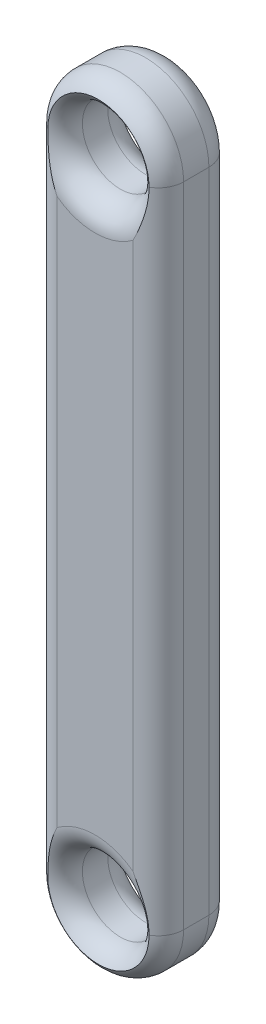
ISO-10303-21;
HEADER;
FILE_DESCRIPTION(('STEP AP214'),'2;1');
FILE_NAME('part.step','',(''),(''),'','','');
FILE_SCHEMA(('AUTOMOTIVE_DESIGN { 1 0 10303 214 1 1 1 1 }'));
ENDSEC;
DATA;
#1=APPLICATION_CONTEXT('core data for automotive mechanical design processes');
#2=APPLICATION_PROTOCOL_DEFINITION('international standard','automotive_design',2000,#1);
#3=PRODUCT_CONTEXT('',#1,'mechanical');
#4=PRODUCT('Part','Part','',(#3));
#5=PRODUCT_RELATED_PRODUCT_CATEGORY('part','',(#4));
#6=PRODUCT_DEFINITION_FORMATION('','',#4);
#7=PRODUCT_DEFINITION_CONTEXT('part definition',#1,'design');
#8=PRODUCT_DEFINITION('design','',#6,#7);
#9=PRODUCT_DEFINITION_SHAPE('','',#8);
#10=(LENGTH_UNIT() NAMED_UNIT(*) SI_UNIT(.MILLI.,.METRE.));
#11=(NAMED_UNIT(*) PLANE_ANGLE_UNIT() SI_UNIT($,.RADIAN.));
#12=(NAMED_UNIT(*) SI_UNIT($,.STERADIAN.) SOLID_ANGLE_UNIT());
#13=UNCERTAINTY_MEASURE_WITH_UNIT(LENGTH_MEASURE(1.E-05),#10,'distance_accuracy_value','');
#14=(GEOMETRIC_REPRESENTATION_CONTEXT(3) GLOBAL_UNCERTAINTY_ASSIGNED_CONTEXT((#13)) GLOBAL_UNIT_ASSIGNED_CONTEXT((#10,
#11,#12)) REPRESENTATION_CONTEXT('',''));
#15=CARTESIAN_POINT('',(0.,0.,0.));
#16=DIRECTION('',(0.,0.,1.));
#17=DIRECTION('',(1.,0.,0.));
#18=AXIS2_PLACEMENT_3D('',#15,#16,#17);
#19=CARTESIAN_POINT('',(0.,0.,3.));
#20=DIRECTION('',(0.,0.,1.));
#21=DIRECTION('',(1.,0.,0.));
#22=AXIS2_PLACEMENT_3D('',#19,#20,#21);
#23=PLANE('',#22);
#24=DIRECTION('',(0.,1.,0.));
#25=VECTOR('',#24,1.);
#26=CARTESIAN_POINT('',(1.5,25.6,3.));
#27=LINE('',#26,#25);
#28=CARTESIAN_POINT('',(1.5,2.,3.));
#29=VERTEX_POINT('',#28);
#30=CARTESIAN_POINT('',(1.5,23.6,3.));
#31=VERTEX_POINT('',#30);
#32=EDGE_CURVE('E343',#29,#31,#27,.T.);
#33=ORIENTED_EDGE('',*,*,#32,.T.);
#34=CARTESIAN_POINT('',(0.,25.6,3.));
#35=DIRECTION('',(0.,0.,1.));
#36=DIRECTION('',(1.,0.,0.));
#37=AXIS2_PLACEMENT_3D('',#34,#35,#36);
#38=CIRCLE('',#37,2.5);
#39=CARTESIAN_POINT('',(-1.5,23.6,3.));
#40=VERTEX_POINT('',#39);
#41=EDGE_CURVE('E340',#31,#40,#38,.F.);
#42=ORIENTED_EDGE('',*,*,#41,.T.);
#43=DIRECTION('',(0.,-1.,0.));
#44=VECTOR('',#43,1.);
#45=CARTESIAN_POINT('',(-1.5,0.,3.));
#46=LINE('',#45,#44);
#47=CARTESIAN_POINT('',(-1.5,2.,3.));
#48=VERTEX_POINT('',#47);
#49=EDGE_CURVE('E345',#40,#48,#46,.T.);
#50=ORIENTED_EDGE('',*,*,#49,.T.);
#51=CARTESIAN_POINT('',(0.,0.,3.));
#52=DIRECTION('',(0.,0.,1.));
#53=DIRECTION('',(1.,0.,0.));
#54=AXIS2_PLACEMENT_3D('',#51,#52,#53);
#55=CIRCLE('',#54,2.5);
#56=EDGE_CURVE('E348',#48,#29,#55,.F.);
#57=ORIENTED_EDGE('',*,*,#56,.T.);
#58=EDGE_LOOP('',(#33,#42,#50,#57));
#59=FACE_BOUND('',#58,.T.);
#60=ADVANCED_FACE('F33',(#59),#23,.T.);
#61=CARTESIAN_POINT('',(0.,0.,0.));
#62=DIRECTION('',(0.,0.,1.));
#63=DIRECTION('',(1.,0.,0.));
#64=AXIS2_PLACEMENT_3D('',#61,#62,#63);
#65=PLANE('',#64);
#66=DIRECTION('',(0.,-1.,0.));
#67=VECTOR('',#66,1.);
#68=CARTESIAN_POINT('',(-1.5,0.,0.));
#69=LINE('',#68,#67);
#70=CARTESIAN_POINT('',(-1.5,2.,0.));
#71=VERTEX_POINT('',#70);
#72=CARTESIAN_POINT('',(-1.5,23.6,0.));
#73=VERTEX_POINT('',#72);
#74=EDGE_CURVE('E330',#71,#73,#69,.F.);
#75=ORIENTED_EDGE('',*,*,#74,.T.);
#76=CARTESIAN_POINT('',(0.,25.6,0.));
#77=DIRECTION('',(0.,0.,1.));
#78=DIRECTION('',(1.,0.,0.));
#79=AXIS2_PLACEMENT_3D('',#76,#77,#78);
#80=CIRCLE('',#79,2.5);
#81=CARTESIAN_POINT('',(1.5,23.6,0.));
#82=VERTEX_POINT('',#81);
#83=EDGE_CURVE('E329',#73,#82,#80,.T.);
#84=ORIENTED_EDGE('',*,*,#83,.T.);
#85=DIRECTION('',(0.,1.,0.));
#86=VECTOR('',#85,1.);
#87=CARTESIAN_POINT('',(1.5,0.,0.));
#88=LINE('',#87,#86);
#89=CARTESIAN_POINT('',(1.5,2.,0.));
#90=VERTEX_POINT('',#89);
#91=EDGE_CURVE('E103',#82,#90,#88,.F.);
#92=ORIENTED_EDGE('',*,*,#91,.T.);
#93=CARTESIAN_POINT('',(0.,0.,0.));
#94=DIRECTION('',(0.,0.,1.));
#95=DIRECTION('',(1.,0.,0.));
#96=AXIS2_PLACEMENT_3D('',#93,#94,#95);
#97=CIRCLE('',#96,2.5);
#98=EDGE_CURVE('E335',#90,#71,#97,.T.);
#99=ORIENTED_EDGE('',*,*,#98,.T.);
#100=EDGE_LOOP('',(#75,#84,#92,#99));
#101=FACE_BOUND('',#100,.T.);
#102=ADVANCED_FACE('F160',(#101),#65,.F.);
#103=CARTESIAN_POINT('',(0.,0.,3.));
#104=DIRECTION('',(0.,0.,-1.));
#105=DIRECTION('',(-1.,0.,0.));
#106=AXIS2_PLACEMENT_3D('',#103,#104,#105);
#107=CYLINDRICAL_SURFACE('',#106,2.5);
#108=DIRECTION('',(0.,0.,-1.));
#109=VECTOR('',#108,1.);
#110=CARTESIAN_POINT('',(2.5,0.,3.));
#111=LINE('',#110,#109);
#112=CARTESIAN_POINT('',(2.5,0.,2.));
#113=VERTEX_POINT('',#112);
#114=CARTESIAN_POINT('',(2.5,0.,1.));
#115=VERTEX_POINT('',#114);
#116=EDGE_CURVE('E357',#113,#115,#111,.T.);
#117=ORIENTED_EDGE('',*,*,#116,.F.);
#118=CARTESIAN_POINT('',(0.,0.,2.));
#119=DIRECTION('',(0.,0.,1.));
#120=DIRECTION('',(1.,0.,0.));
#121=AXIS2_PLACEMENT_3D('',#118,#119,#120);
#122=CIRCLE('',#121,2.5);
#123=CARTESIAN_POINT('',(-2.5,0.,2.));
#124=VERTEX_POINT('',#123);
#125=EDGE_CURVE('E351',#113,#124,#122,.F.);
#126=ORIENTED_EDGE('',*,*,#125,.T.);
#127=DIRECTION('',(0.,0.,-1.));
#128=VECTOR('',#127,1.);
#129=CARTESIAN_POINT('',(-2.5,0.,3.));
#130=LINE('',#129,#128);
#131=CARTESIAN_POINT('',(-2.5,0.,1.));
#132=VERTEX_POINT('',#131);
#133=EDGE_CURVE('E252',#124,#132,#130,.T.);
#134=ORIENTED_EDGE('',*,*,#133,.T.);
#135=CARTESIAN_POINT('',(0.,0.,1.));
#136=DIRECTION('',(0.,0.,1.));
#137=DIRECTION('',(1.,0.,0.));
#138=AXIS2_PLACEMENT_3D('',#135,#136,#137);
#139=CIRCLE('',#138,2.5);
#140=EDGE_CURVE('E354',#132,#115,#139,.T.);
#141=ORIENTED_EDGE('',*,*,#140,.T.);
#142=EDGE_LOOP('',(#117,#126,#134,#141));
#143=FACE_BOUND('',#142,.T.);
#144=ADVANCED_FACE('F166',(#143),#107,.T.);
#145=CARTESIAN_POINT('',(2.5,0.,3.));
#146=DIRECTION('',(-1.,0.,0.));
#147=DIRECTION('',(0.,-1.,0.));
#148=AXIS2_PLACEMENT_3D('',#145,#146,#147);
#149=PLANE('',#148);
#150=DIRECTION('',(0.,0.,-1.));
#151=VECTOR('',#150,1.);
#152=CARTESIAN_POINT('',(2.5,25.6,3.));
#153=LINE('',#152,#151);
#154=CARTESIAN_POINT('',(2.5,25.6,2.));
#155=VERTEX_POINT('',#154);
#156=CARTESIAN_POINT('',(2.5,25.6,1.));
#157=VERTEX_POINT('',#156);
#158=EDGE_CURVE('E360',#155,#157,#153,.T.);
#159=ORIENTED_EDGE('',*,*,#158,.F.);
#160=DIRECTION('',(0.,1.,0.));
#161=VECTOR('',#160,1.);
#162=CARTESIAN_POINT('',(2.5,0.,2.));
#163=LINE('',#162,#161);
#164=EDGE_CURVE('E309',#155,#113,#163,.F.);
#165=ORIENTED_EDGE('',*,*,#164,.T.);
#166=ORIENTED_EDGE('',*,*,#116,.T.);
#167=DIRECTION('',(0.,1.,0.));
#168=VECTOR('',#167,1.);
#169=CARTESIAN_POINT('',(2.5,0.,1.));
#170=LINE('',#169,#168);
#171=EDGE_CURVE('E338',#115,#157,#170,.T.);
#172=ORIENTED_EDGE('',*,*,#171,.T.);
#173=EDGE_LOOP('',(#159,#165,#166,#172));
#174=FACE_BOUND('',#173,.T.);
#175=ADVANCED_FACE('F181',(#174),#149,.F.);
#176=CARTESIAN_POINT('',(0.,25.6,3.));
#177=DIRECTION('',(0.,0.,-1.));
#178=DIRECTION('',(-1.,0.,0.));
#179=AXIS2_PLACEMENT_3D('',#176,#177,#178);
#180=CYLINDRICAL_SURFACE('',#179,2.5);
#181=DIRECTION('',(0.,0.,-1.));
#182=VECTOR('',#181,1.);
#183=CARTESIAN_POINT('',(-2.5,25.6,3.));
#184=LINE('',#183,#182);
#185=CARTESIAN_POINT('',(-2.5,25.6,2.));
#186=VERTEX_POINT('',#185);
#187=CARTESIAN_POINT('',(-2.5,25.6,1.));
#188=VERTEX_POINT('',#187);
#189=EDGE_CURVE('E362',#186,#188,#184,.T.);
#190=ORIENTED_EDGE('',*,*,#189,.F.);
#191=CARTESIAN_POINT('',(0.,25.6,2.));
#192=DIRECTION('',(0.,0.,1.));
#193=DIRECTION('',(1.,0.,0.));
#194=AXIS2_PLACEMENT_3D('',#191,#192,#193);
#195=CIRCLE('',#194,2.5);
#196=EDGE_CURVE('E274',#186,#155,#195,.F.);
#197=ORIENTED_EDGE('',*,*,#196,.T.);
#198=ORIENTED_EDGE('',*,*,#158,.T.);
#199=CARTESIAN_POINT('',(0.,25.6,1.));
#200=DIRECTION('',(0.,0.,1.));
#201=DIRECTION('',(1.,0.,0.));
#202=AXIS2_PLACEMENT_3D('',#199,#200,#201);
#203=CIRCLE('',#202,2.5);
#204=EDGE_CURVE('E52',#157,#188,#203,.T.);
#205=ORIENTED_EDGE('',*,*,#204,.T.);
#206=EDGE_LOOP('',(#190,#197,#198,#205));
#207=FACE_BOUND('',#206,.T.);
#208=ADVANCED_FACE('F177',(#207),#180,.T.);
#209=CARTESIAN_POINT('',(-2.5,0.,3.));
#210=DIRECTION('',(1.,0.,0.));
#211=DIRECTION('',(0.,1.,0.));
#212=AXIS2_PLACEMENT_3D('',#209,#210,#211);
#213=PLANE('',#212);
#214=ORIENTED_EDGE('',*,*,#133,.F.);
#215=DIRECTION('',(0.,-1.,0.));
#216=VECTOR('',#215,1.);
#217=CARTESIAN_POINT('',(-2.5,25.6,2.));
#218=LINE('',#217,#216);
#219=EDGE_CURVE('E273',#124,#186,#218,.F.);
#220=ORIENTED_EDGE('',*,*,#219,.T.);
#221=ORIENTED_EDGE('',*,*,#189,.T.);
#222=DIRECTION('',(0.,-1.,0.));
#223=VECTOR('',#222,1.);
#224=CARTESIAN_POINT('',(-2.5,0.,1.));
#225=LINE('',#224,#223);
#226=EDGE_CURVE('E269',#188,#132,#225,.T.);
#227=ORIENTED_EDGE('',*,*,#226,.T.);
#228=EDGE_LOOP('',(#214,#220,#221,#227));
#229=FACE_BOUND('',#228,.T.);
#230=ADVANCED_FACE('F174',(#229),#213,.F.);
#231=CARTESIAN_POINT('',(0.,25.6,3.));
#232=DIRECTION('',(0.,0.,-1.));
#233=DIRECTION('',(-1.,0.,0.));
#234=AXIS2_PLACEMENT_3D('',#231,#232,#233);
#235=CYLINDRICAL_SURFACE('',#234,1.5);
#236=CARTESIAN_POINT('',(0.,25.6,1.));
#237=DIRECTION('',(0.,0.,1.));
#238=DIRECTION('',(1.,0.,0.));
#239=AXIS2_PLACEMENT_3D('',#236,#237,#238);
#240=CIRCLE('',#239,1.5);
#241=CARTESIAN_POINT('',(1.5,25.6,1.));
#242=VERTEX_POINT('',#241);
#243=EDGE_CURVE('E284',#242,#242,#240,.F.);
#244=ORIENTED_EDGE('',*,*,#243,.T.);
#245=EDGE_LOOP('',(#244));
#246=FACE_BOUND('',#245,.T.);
#247=CARTESIAN_POINT('',(0.,25.6,2.));
#248=DIRECTION('',(0.,0.,1.));
#249=DIRECTION('',(1.,0.,0.));
#250=AXIS2_PLACEMENT_3D('',#247,#248,#249);
#251=CIRCLE('',#250,1.5);
#252=CARTESIAN_POINT('',(1.5,25.6,2.));
#253=VERTEX_POINT('',#252);
#254=EDGE_CURVE('E276',#253,#253,#251,.T.);
#255=ORIENTED_EDGE('',*,*,#254,.T.);
#256=EDGE_LOOP('',(#255));
#257=FACE_BOUND('',#256,.T.);
#258=ADVANCED_FACE('F171',(#246,#257),#235,.F.);
#259=CARTESIAN_POINT('',(0.,0.,3.));
#260=DIRECTION('',(0.,0.,-1.));
#261=DIRECTION('',(-1.,0.,0.));
#262=AXIS2_PLACEMENT_3D('',#259,#260,#261);
#263=CYLINDRICAL_SURFACE('',#262,1.5);
#264=CARTESIAN_POINT('',(0.,0.,1.));
#265=DIRECTION('',(0.,0.,1.));
#266=DIRECTION('',(1.,0.,0.));
#267=AXIS2_PLACEMENT_3D('',#264,#265,#266);
#268=CIRCLE('',#267,1.5);
#269=CARTESIAN_POINT('',(1.5,0.,1.));
#270=VERTEX_POINT('',#269);
#271=EDGE_CURVE('E11',#270,#270,#268,.F.);
#272=ORIENTED_EDGE('',*,*,#271,.T.);
#273=EDGE_LOOP('',(#272));
#274=FACE_BOUND('',#273,.T.);
#275=CARTESIAN_POINT('',(0.,0.,2.));
#276=DIRECTION('',(0.,0.,1.));
#277=DIRECTION('',(1.,0.,0.));
#278=AXIS2_PLACEMENT_3D('',#275,#276,#277);
#279=CIRCLE('',#278,1.5);
#280=CARTESIAN_POINT('',(1.5,0.,2.));
#281=VERTEX_POINT('',#280);
#282=EDGE_CURVE('E43',#281,#281,#279,.T.);
#283=ORIENTED_EDGE('',*,*,#282,.T.);
#284=EDGE_LOOP('',(#283));
#285=FACE_BOUND('',#284,.T.);
#286=ADVANCED_FACE('F451',(#274,#285),#263,.F.);
#287=CARTESIAN_POINT('',(0.,25.6,2.));
#288=DIRECTION('',(0.,0.,1.));
#289=DIRECTION('',(1.,0.,0.));
#290=AXIS2_PLACEMENT_3D('',#287,#288,#289);
#291=TOROIDAL_SURFACE('',#290,2.5,1.);
#292=ORIENTED_EDGE('',*,*,#254,.F.);
#293=EDGE_LOOP('',(#292));
#294=FACE_BOUND('',#293,.T.);
#295=CARTESIAN_POINT('',(0.,25.6,2.86602540378444));
#296=DIRECTION('',(0.,0.,-1.));
#297=DIRECTION('',(-1.,0.,0.));
#298=AXIS2_PLACEMENT_3D('',#295,#296,#297);
#299=CIRCLE('',#298,2.);
#300=CARTESIAN_POINT('',(-2.,25.6,2.86602540378444));
#301=VERTEX_POINT('',#300);
#302=CARTESIAN_POINT('',(2.,25.6,2.86602540378444));
#303=VERTEX_POINT('',#302);
#304=EDGE_CURVE('E250',#301,#303,#299,.T.);
#305=ORIENTED_EDGE('',*,*,#304,.F.);
#306=CARTESIAN_POINT('',(-1.5,23.6,3.00000000000004));
#307=CARTESIAN_POINT('',(-1.50105408772556,23.6021081460759,2.99999999405972));
#308=CARTESIAN_POINT('',(-1.50210684734476,23.6042169990216,2.99999832762935));
#309=CARTESIAN_POINT('',(-1.61359199565953,23.8278979228539,2.99964683182834));
#310=CARTESIAN_POINT('',(-1.70933323535513,24.0572424712006,2.98111211959654));
#311=CARTESIAN_POINT('',(-1.82454022661043,24.4093597768189,2.94672662718864));
#312=CARTESIAN_POINT('',(-1.85823747231409,24.5282664244824,2.93414376133102));
#313=CARTESIAN_POINT('',(-1.91539640288077,24.7686155643102,2.91016928917788));
#314=CARTESIAN_POINT('',(-1.9388689605784,24.8900552181389,2.89877642729612));
#315=CARTESIAN_POINT('',(-1.97111835724976,25.1095958973522,2.88221740814729));
#316=CARTESIAN_POINT('',(-1.98192896265326,25.2073377651103,2.87625124658863));
#317=CARTESIAN_POINT('',(-1.99276195487876,25.3544230217855,2.87017308801062));
#318=CARTESIAN_POINT('',(-1.99547579339886,25.4035178956243,2.8686255773568));
#319=CARTESIAN_POINT('',(-1.99909711208381,25.5018068133347,2.8665472494052));
#320=CARTESIAN_POINT('',(-2.0000041738932,25.5510008775348,2.86601666757628));
#321=CARTESIAN_POINT('',(-1.99999999500014,25.6002,2.86602540667132));
#322=B_SPLINE_CURVE_WITH_KNOTS('',3,(#306,#307,#308,#309,#310,#311,#312,#313,#314,#315,#316,
#317,#318,#319,#320,#321),.UNSPECIFIED.,.F.,.F.,(4,2,2,2,2,2,2,4),(0.,0.00707107098671323,
0.749760858527253,1.12222276075009,1.49428761789497,1.78951935714071,1.93706174397463,
2.08463828997787),.UNSPECIFIED.);
#323=EDGE_CURVE('E240',#40,#301,#322,.T.);
#324=ORIENTED_EDGE('',*,*,#323,.F.);
#325=ORIENTED_EDGE('',*,*,#41,.F.);
#326=CARTESIAN_POINT('',(1.999999995,25.6002,2.86602540667119));
#327=CARTESIAN_POINT('',(2.0000058530589,25.5462123088919,2.86601083367114));
#328=CARTESIAN_POINT('',(1.9989124935819,25.4922276616156,2.86665306079238));
#329=CARTESIAN_POINT('',(1.99455135501886,25.3843864611017,2.86915498711415));
#330=CARTESIAN_POINT('',(1.99128407456004,25.3305298813317,2.8710144071284));
#331=CARTESIAN_POINT('',(1.98260622382654,25.2231302482314,2.87585069683843));
#332=CARTESIAN_POINT('',(1.9771991831062,25.169586825204,2.87882572590525));
#333=CARTESIAN_POINT('',(1.96428554400601,25.0628159587317,2.88571571883685));
#334=CARTESIAN_POINT('',(1.95677884379193,25.0095885307404,2.8896307282897));
#335=CARTESIAN_POINT('',(1.93122279458116,24.8507274641053,2.90244796794199));
#336=CARTESIAN_POINT('',(1.91011661499164,24.7456617601958,2.91243570662408));
#337=CARTESIAN_POINT('',(1.86023194001867,24.5374597556277,2.93325199781923));
#338=CARTESIAN_POINT('',(1.83145210214487,24.4343237959558,2.94408069722144));
#339=CARTESIAN_POINT('',(1.77937590032373,24.2700123802438,2.96040447896624));
#340=CARTESIAN_POINT('',(1.75832002570525,24.2081630072034,2.96633232750253));
#341=CARTESIAN_POINT('',(1.7136863146066,24.0853101029476,2.97717224301164));
#342=CARTESIAN_POINT('',(1.69010884729743,24.0243064493887,2.98208445836908));
#343=CARTESIAN_POINT('',(1.61584462822613,23.8427717753058,2.99453386944145));
#344=CARTESIAN_POINT('',(1.56155121018482,23.7234835697918,2.99981076244389));
#345=CARTESIAN_POINT('',(1.50210684450801,23.6042170124958,2.99999833026909));
#346=CARTESIAN_POINT('',(1.50105408473972,23.6021081593818,2.99999999676171));
#347=CARTESIAN_POINT('',(1.5,23.6,3.00000000000004));
#348=B_SPLINE_CURVE_WITH_KNOTS('',3,(#326,#327,#328,#329,#330,#331,#332,#333,#334,#335,#336,
#337,#338,#339,#340,#341,#342,#343,#344,#345,#346,#347),.UNSPECIFIED.,.F.,.F.,(4,2,2,2,2,2,2,2,
2,2,4),(0.,0.16194300557925,0.323848879464256,0.4854887939129,0.647136549314598,
0.969671018314037,1.29226195110516,1.48901141462258,1.68573211258134,2.0784357117688,
2.08550678275551),.UNSPECIFIED.);
#349=EDGE_CURVE('E198',#303,#31,#348,.T.);
#350=ORIENTED_EDGE('',*,*,#349,.F.);
#351=EDGE_LOOP('',(#305,#324,#325,#350));
#352=FACE_BOUND('',#351,.T.);
#353=ADVANCED_FACE('F194',(#294,#352),#291,.T.);
#354=CARTESIAN_POINT('',(0.,25.6,2.));
#355=DIRECTION('',(0.,0.,1.));
#356=DIRECTION('',(1.,0.,0.));
#357=AXIS2_PLACEMENT_3D('',#354,#355,#356);
#358=TOROIDAL_SURFACE('',#357,1.5,1.);
#359=CARTESIAN_POINT('',(1.5,25.6,2.));
#360=DIRECTION('',(0.,-1.,0.));
#361=DIRECTION('',(0.,0.,-1.));
#362=AXIS2_PLACEMENT_3D('',#359,#360,#361);
#363=CIRCLE('',#362,1.);
#364=EDGE_CURVE('E207',#155,#303,#363,.T.);
#365=ORIENTED_EDGE('',*,*,#364,.F.);
#366=ORIENTED_EDGE('',*,*,#196,.F.);
#367=CARTESIAN_POINT('',(-1.5,25.6,2.));
#368=DIRECTION('',(0.,-1.,0.));
#369=DIRECTION('',(0.,0.,-1.));
#370=AXIS2_PLACEMENT_3D('',#367,#368,#369);
#371=CIRCLE('',#370,1.);
#372=EDGE_CURVE('E247',#301,#186,#371,.T.);
#373=ORIENTED_EDGE('',*,*,#372,.F.);
#374=ORIENTED_EDGE('',*,*,#304,.T.);
#375=EDGE_LOOP('',(#365,#366,#373,#374));
#376=FACE_BOUND('',#375,.T.);
#377=ADVANCED_FACE('F234',(#376),#358,.T.);
#378=CARTESIAN_POINT('',(-1.5,0.,2.));
#379=DIRECTION('',(0.,1.,0.));
#380=DIRECTION('',(-1.,0.,0.));
#381=AXIS2_PLACEMENT_3D('',#378,#379,#380);
#382=CYLINDRICAL_SURFACE('',#381,1.);
#383=CARTESIAN_POINT('',(-1.999999995,-0.000200000000000001,2.86602540667119));
#384=CARTESIAN_POINT('',(-2.0000058530589,0.0537876911081237,2.86601083367114));
#385=CARTESIAN_POINT('',(-1.9989124935819,0.107772338384437,2.86665306079237));
#386=CARTESIAN_POINT('',(-1.99455135501885,0.215613538898378,2.86915498711415));
#387=CARTESIAN_POINT('',(-1.99128407456004,0.269470118668366,2.8710144071284));
#388=CARTESIAN_POINT('',(-1.98260622382653,0.376869751768666,2.87585069683843));
#389=CARTESIAN_POINT('',(-1.9771991831062,0.430413174796037,2.87882572590525));
#390=CARTESIAN_POINT('',(-1.964285544006,0.537184041268404,2.88571571883685));
#391=CARTESIAN_POINT('',(-1.95677884379192,0.590411469259626,2.88963072828971));
#392=CARTESIAN_POINT('',(-1.93122279458114,0.749272535894773,2.90244796794199));
#393=CARTESIAN_POINT('',(-1.91011661499163,0.854338239804283,2.91243570662408));
#394=CARTESIAN_POINT('',(-1.86023194001867,1.06254024437235,2.93325199781923));
#395=CARTESIAN_POINT('',(-1.83145210214487,1.1656762040442,2.94408069722143));
#396=CARTESIAN_POINT('',(-1.77937590032373,1.32998761975623,2.96040447896624));
#397=CARTESIAN_POINT('',(-1.75832002570524,1.3918369927966,2.96633232750255));
#398=CARTESIAN_POINT('',(-1.7136863146066,1.51468989705246,2.97717224301163));
#399=CARTESIAN_POINT('',(-1.69010884729745,1.57569355061133,2.98208445836903));
#400=CARTESIAN_POINT('',(-1.61584462822608,1.75722822469417,2.99453386944157));
#401=CARTESIAN_POINT('',(-1.56155121018457,1.87651643020807,2.99981076244454));
#402=CARTESIAN_POINT('',(-1.502106844508,1.99578298750421,2.99999833026908));
#403=CARTESIAN_POINT('',(-1.50105408473971,1.99789184061818,2.99999999676168));
#404=CARTESIAN_POINT('',(-1.5,2.,3.));
#405=B_SPLINE_CURVE_WITH_KNOTS('',3,(#383,#384,#385,#386,#387,#388,#389,#390,#391,#392,#393,
#394,#395,#396,#397,#398,#399,#400,#401,#402,#403,#404),.UNSPECIFIED.,.F.,.F.,(4,2,2,2,2,2,2,2,
2,2,4),(0.,0.161943005579275,0.323848879464301,0.485488793912966,0.647136549314678,
0.969671018314074,1.29226195110516,1.48901141462259,1.68573211258137,2.0784357117688,
2.08550678275551),.UNSPECIFIED.);
#406=CARTESIAN_POINT('',(-2.,0.,2.86602540378444));
#407=VERTEX_POINT('',#406);
#408=EDGE_CURVE('E215',#48,#407,#405,.F.);
#409=ORIENTED_EDGE('',*,*,#408,.F.);
#410=ORIENTED_EDGE('',*,*,#49,.F.);
#411=ORIENTED_EDGE('',*,*,#323,.T.);
#412=ORIENTED_EDGE('',*,*,#372,.T.);
#413=ORIENTED_EDGE('',*,*,#219,.F.);
#414=CARTESIAN_POINT('',(-1.5,0.,2.));
#415=DIRECTION('',(0.,-1.,0.));
#416=DIRECTION('',(0.,0.,-1.));
#417=AXIS2_PLACEMENT_3D('',#414,#415,#416);
#418=CIRCLE('',#417,1.);
#419=EDGE_CURVE('E293',#407,#124,#418,.T.);
#420=ORIENTED_EDGE('',*,*,#419,.F.);
#421=EDGE_LOOP('',(#409,#410,#411,#412,#413,#420));
#422=FACE_BOUND('',#421,.T.);
#423=ADVANCED_FACE('F228',(#422),#382,.T.);
#424=CARTESIAN_POINT('',(0.,0.,2.));
#425=DIRECTION('',(0.,0.,1.));
#426=DIRECTION('',(1.,0.,0.));
#427=AXIS2_PLACEMENT_3D('',#424,#425,#426);
#428=TOROIDAL_SURFACE('',#427,2.5,1.);
#429=ORIENTED_EDGE('',*,*,#282,.F.);
#430=EDGE_LOOP('',(#429));
#431=FACE_BOUND('',#430,.T.);
#432=CARTESIAN_POINT('',(1.5,2.,3.));
#433=CARTESIAN_POINT('',(1.50105408772556,1.9978918539241,2.9999999940597));
#434=CARTESIAN_POINT('',(1.50210684734476,1.99578300097841,2.99999832762934));
#435=CARTESIAN_POINT('',(1.61359199565953,1.77210207714617,2.9996468318296));
#436=CARTESIAN_POINT('',(1.7093332353551,1.5427575287995,2.98111211959677));
#437=CARTESIAN_POINT('',(1.8245402266104,1.19064022318122,2.94672662718854));
#438=CARTESIAN_POINT('',(1.85823747231407,1.0717335755177,2.934143761331));
#439=CARTESIAN_POINT('',(1.91539640288075,0.831384435689828,2.91016928917791));
#440=CARTESIAN_POINT('',(1.9388689605784,0.709944781861168,2.89877642729613));
#441=CARTESIAN_POINT('',(1.97111835724976,0.490404102647832,2.88221740814729));
#442=CARTESIAN_POINT('',(1.98192896265326,0.392662234889732,2.87625124658863));
#443=CARTESIAN_POINT('',(1.99276195487876,0.245576978214505,2.87017308801062));
#444=CARTESIAN_POINT('',(1.99547579339886,0.196482104375741,2.8686255773568));
#445=CARTESIAN_POINT('',(1.99909711208381,0.0981931866652818,2.8665472494052));
#446=CARTESIAN_POINT('',(2.0000041738932,0.0489991224652197,2.86601666757628));
#447=CARTESIAN_POINT('',(1.99999999500014,-0.000199999999988751,2.86602540667132));
#448=B_SPLINE_CURVE_WITH_KNOTS('',3,(#432,#433,#434,#435,#436,#437,#438,#439,#440,#441,#442,
#443,#444,#445,#446,#447),.UNSPECIFIED.,.F.,.F.,(4,2,2,2,2,2,2,4),(0.,0.00707107098671204,
0.749760858527121,1.12222276075002,1.49428761789493,1.78951935714071,1.93706174397464,
2.08463828997788),.UNSPECIFIED.);
#449=CARTESIAN_POINT('',(2.,0.,2.86602540378444));
#450=VERTEX_POINT('',#449);
#451=EDGE_CURVE('E206',#29,#450,#448,.T.);
#452=ORIENTED_EDGE('',*,*,#451,.F.);
#453=ORIENTED_EDGE('',*,*,#56,.F.);
#454=ORIENTED_EDGE('',*,*,#408,.T.);
#455=CARTESIAN_POINT('',(0.,0.,2.86602540378444));
#456=DIRECTION('',(0.,0.,-1.));
#457=DIRECTION('',(-1.,0.,0.));
#458=AXIS2_PLACEMENT_3D('',#455,#456,#457);
#459=CIRCLE('',#458,2.);
#460=EDGE_CURVE('E291',#450,#407,#459,.T.);
#461=ORIENTED_EDGE('',*,*,#460,.F.);
#462=EDGE_LOOP('',(#452,#453,#454,#461));
#463=FACE_BOUND('',#462,.T.);
#464=ADVANCED_FACE('F224',(#431,#463),#428,.T.);
#465=CARTESIAN_POINT('',(1.5,0.,2.));
#466=DIRECTION('',(0.,-1.,0.));
#467=DIRECTION('',(1.,0.,0.));
#468=AXIS2_PLACEMENT_3D('',#465,#466,#467);
#469=CYLINDRICAL_SURFACE('',#468,1.);
#470=ORIENTED_EDGE('',*,*,#32,.F.);
#471=ORIENTED_EDGE('',*,*,#451,.T.);
#472=CARTESIAN_POINT('',(1.5,0.,2.));
#473=DIRECTION('',(0.,-1.,0.));
#474=DIRECTION('',(0.,0.,-1.));
#475=AXIS2_PLACEMENT_3D('',#472,#473,#474);
#476=CIRCLE('',#475,1.);
#477=EDGE_CURVE('E94',#113,#450,#476,.T.);
#478=ORIENTED_EDGE('',*,*,#477,.F.);
#479=ORIENTED_EDGE('',*,*,#164,.F.);
#480=ORIENTED_EDGE('',*,*,#364,.T.);
#481=ORIENTED_EDGE('',*,*,#349,.T.);
#482=EDGE_LOOP('',(#470,#471,#478,#479,#480,#481));
#483=FACE_BOUND('',#482,.T.);
#484=ADVANCED_FACE('F190',(#483),#469,.T.);
#485=CARTESIAN_POINT('',(0.,0.,2.));
#486=DIRECTION('',(0.,0.,1.));
#487=DIRECTION('',(1.,0.,0.));
#488=AXIS2_PLACEMENT_3D('',#485,#486,#487);
#489=TOROIDAL_SURFACE('',#488,1.5,1.);
#490=ORIENTED_EDGE('',*,*,#419,.T.);
#491=ORIENTED_EDGE('',*,*,#125,.F.);
#492=ORIENTED_EDGE('',*,*,#477,.T.);
#493=ORIENTED_EDGE('',*,*,#460,.T.);
#494=EDGE_LOOP('',(#490,#491,#492,#493));
#495=FACE_BOUND('',#494,.T.);
#496=ADVANCED_FACE('F125',(#495),#489,.T.);
#497=CARTESIAN_POINT('',(0.,25.6,1.));
#498=DIRECTION('',(0.,0.,1.));
#499=DIRECTION('',(1.,0.,0.));
#500=AXIS2_PLACEMENT_3D('',#497,#498,#499);
#501=TOROIDAL_SURFACE('',#500,2.5,1.);
#502=ORIENTED_EDGE('',*,*,#243,.F.);
#503=EDGE_LOOP('',(#502));
#504=FACE_BOUND('',#503,.T.);
#505=CARTESIAN_POINT('',(0.,25.6,0.133974596215561));
#506=DIRECTION('',(0.,0.,1.));
#507=DIRECTION('',(1.,0.,0.));
#508=AXIS2_PLACEMENT_3D('',#505,#506,#507);
#509=CIRCLE('',#508,2.);
#510=CARTESIAN_POINT('',(2.,25.6,0.133974596215561));
#511=VERTEX_POINT('',#510);
#512=CARTESIAN_POINT('',(-2.,25.6,0.133974596215561));
#513=VERTEX_POINT('',#512);
#514=EDGE_CURVE('E37',#511,#513,#509,.T.);
#515=ORIENTED_EDGE('',*,*,#514,.F.);
#516=CARTESIAN_POINT('',(1.5,23.6,0.));
#517=CARTESIAN_POINT('',(1.50105408772556,23.6021081460759,5.94027576503139E-09));
#518=CARTESIAN_POINT('',(1.50210684734476,23.6042169990216,1.67237064646071E-06));
#519=CARTESIAN_POINT('',(1.61359199565953,23.8278979228539,0.000353168171656318));
#520=CARTESIAN_POINT('',(1.70933323535513,24.0572424712006,0.0188878804034636));
#521=CARTESIAN_POINT('',(1.82454022661043,24.4093597768189,0.0532733728113555));
#522=CARTESIAN_POINT('',(1.85823747231409,24.5282664244824,0.0658562386689782));
#523=CARTESIAN_POINT('',(1.91539640288077,24.7686155643102,0.0898307108221233));
#524=CARTESIAN_POINT('',(1.9388689605784,24.8900552181389,0.101223572703882));
#525=CARTESIAN_POINT('',(1.97111835724976,25.1095958973522,0.117782591852709));
#526=CARTESIAN_POINT('',(1.98192896265326,25.2073377651103,0.123748753411368));
#527=CARTESIAN_POINT('',(1.99276195487876,25.3544230217855,0.129826911989376));
#528=CARTESIAN_POINT('',(1.99547579339886,25.4035178956243,0.131374422643198));
#529=CARTESIAN_POINT('',(1.99909711208381,25.5018068133347,0.133452750594803));
#530=CARTESIAN_POINT('',(2.0000041738932,25.5510008775348,0.133983332423716));
#531=CARTESIAN_POINT('',(1.99999999500014,25.6002,0.133974593328684));
#532=B_SPLINE_CURVE_WITH_KNOTS('',3,(#516,#517,#518,#519,#520,#521,#522,#523,#524,#525,#526,
#527,#528,#529,#530,#531),.UNSPECIFIED.,.F.,.F.,(4,2,2,2,2,2,2,4),(0.,0.00707107098671323,
0.749760858527253,1.12222276075009,1.49428761789497,1.78951935714071,1.93706174397463,
2.08463828997787),.UNSPECIFIED.);
#533=EDGE_CURVE('E89',#82,#511,#532,.T.);
#534=ORIENTED_EDGE('',*,*,#533,.F.);
#535=ORIENTED_EDGE('',*,*,#83,.F.);
#536=CARTESIAN_POINT('',(-1.999999995,25.6002,0.13397459332881));
#537=CARTESIAN_POINT('',(-2.0000058530589,25.5462123088919,0.133989166328858));
#538=CARTESIAN_POINT('',(-1.9989124935819,25.4922276616156,0.133346939207626));
#539=CARTESIAN_POINT('',(-1.99455135501886,25.3843864611017,0.130845012885847));
#540=CARTESIAN_POINT('',(-1.99128407456004,25.3305298813317,0.128985592871603));
#541=CARTESIAN_POINT('',(-1.98260622382654,25.2231302482314,0.124149303161569));
#542=CARTESIAN_POINT('',(-1.9771991831062,25.169586825204,0.121174274094749));
#543=CARTESIAN_POINT('',(-1.96428554400602,25.0628159587317,0.114284281163155));
#544=CARTESIAN_POINT('',(-1.95677884379193,25.0095885307405,0.110369271710302));
#545=CARTESIAN_POINT('',(-1.93122279458116,24.8507274641053,0.0975520320580135));
#546=CARTESIAN_POINT('',(-1.91011661499164,24.7456617601958,0.0875642933759256));
#547=CARTESIAN_POINT('',(-1.86023194001867,24.5374597556277,0.0667480021807688));
#548=CARTESIAN_POINT('',(-1.83145210214488,24.4343237959558,0.0559193027785589));
#549=CARTESIAN_POINT('',(-1.77937590032373,24.2700123802438,0.039595521033762));
#550=CARTESIAN_POINT('',(-1.75832002570525,24.2081630072034,0.0336676724974711));
#551=CARTESIAN_POINT('',(-1.7136863146066,24.0853101029476,0.0228277569883566));
#552=CARTESIAN_POINT('',(-1.69010884729743,24.0243064493887,0.0179155416309162));
#553=CARTESIAN_POINT('',(-1.61584462822613,23.8427717753058,0.00546613055854641));
#554=CARTESIAN_POINT('',(-1.56155121018486,23.7234835697918,0.000189237556110589));
#555=CARTESIAN_POINT('',(-1.50210684450802,23.6042170124958,1.66973090917159E-06));
#556=CARTESIAN_POINT('',(-1.50105408473972,23.6021081593818,3.23829387665901E-09));
#557=CARTESIAN_POINT('',(-1.5,23.6,0.));
#558=B_SPLINE_CURVE_WITH_KNOTS('',3,(#536,#537,#538,#539,#540,#541,#542,#543,#544,#545,#546,
#547,#548,#549,#550,#551,#552,#553,#554,#555,#556,#557),.UNSPECIFIED.,.F.,.F.,(4,2,2,2,2,2,2,2,
2,2,4),(0.,0.161943005579247,0.323848879464238,0.485488793912879,0.647136549314573,
0.969671018314023,1.29226195110516,1.48901141462259,1.68573211258134,2.0784357117688,
2.08550678275551),.UNSPECIFIED.);
#559=EDGE_CURVE('E92',#513,#73,#558,.T.);
#560=ORIENTED_EDGE('',*,*,#559,.F.);
#561=EDGE_LOOP('',(#515,#534,#535,#560));
#562=FACE_BOUND('',#561,.T.);
#563=ADVANCED_FACE('F86',(#504,#562),#501,.T.);
#564=CARTESIAN_POINT('',(0.,25.6,1.));
#565=DIRECTION('',(0.,0.,1.));
#566=DIRECTION('',(1.,0.,0.));
#567=AXIS2_PLACEMENT_3D('',#564,#565,#566);
#568=TOROIDAL_SURFACE('',#567,1.5,1.);
#569=CARTESIAN_POINT('',(-1.5,25.6,1.));
#570=DIRECTION('',(0.,-1.,0.));
#571=DIRECTION('',(0.,0.,-1.));
#572=AXIS2_PLACEMENT_3D('',#569,#570,#571);
#573=CIRCLE('',#572,1.);
#574=EDGE_CURVE('E138',#188,#513,#573,.T.);
#575=ORIENTED_EDGE('',*,*,#574,.F.);
#576=ORIENTED_EDGE('',*,*,#204,.F.);
#577=CARTESIAN_POINT('',(1.5,25.6,1.));
#578=DIRECTION('',(0.,-1.,0.));
#579=DIRECTION('',(0.,0.,-1.));
#580=AXIS2_PLACEMENT_3D('',#577,#578,#579);
#581=CIRCLE('',#580,1.);
#582=EDGE_CURVE('E95',#511,#157,#581,.T.);
#583=ORIENTED_EDGE('',*,*,#582,.F.);
#584=ORIENTED_EDGE('',*,*,#514,.T.);
#585=EDGE_LOOP('',(#575,#576,#583,#584));
#586=FACE_BOUND('',#585,.T.);
#587=ADVANCED_FACE('F35',(#586),#568,.T.);
#588=CARTESIAN_POINT('',(1.5,0.,1.));
#589=DIRECTION('',(0.,1.,0.));
#590=DIRECTION('',(-1.,0.,0.));
#591=AXIS2_PLACEMENT_3D('',#588,#589,#590);
#592=CYLINDRICAL_SURFACE('',#591,1.);
#593=CARTESIAN_POINT('',(1.999999995,-0.0002,0.13397459332881));
#594=CARTESIAN_POINT('',(2.0000058530589,0.0537876911081186,0.133989166328859));
#595=CARTESIAN_POINT('',(1.9989124935819,0.107772338384426,0.133346939207626));
#596=CARTESIAN_POINT('',(1.99455135501885,0.215613538898357,0.130845012885847));
#597=CARTESIAN_POINT('',(1.99128407456004,0.26947011866834,0.128985592871602));
#598=CARTESIAN_POINT('',(1.98260622382654,0.376869751768631,0.124149303161567));
#599=CARTESIAN_POINT('',(1.9771991831062,0.430413174795999,0.121174274094747));
#600=CARTESIAN_POINT('',(1.96428554400601,0.537184041268357,0.114284281163152));
#601=CARTESIAN_POINT('',(1.95677884379193,0.590411469259575,0.110369271710299));
#602=CARTESIAN_POINT('',(1.93122279458115,0.749272535894728,0.0975520320580098));
#603=CARTESIAN_POINT('',(1.91011661499163,0.854338239804247,0.0875642933759204));
#604=CARTESIAN_POINT('',(1.86023194001867,1.06254024437233,0.0667480021807696));
#605=CARTESIAN_POINT('',(1.83145210214488,1.16567620404419,0.0559193027785672));
#606=CARTESIAN_POINT('',(1.77937590032373,1.32998761975623,0.0395955210337567));
#607=CARTESIAN_POINT('',(1.75832002570524,1.3918369927966,0.0336676724974544));
#608=CARTESIAN_POINT('',(1.7136863146066,1.51468989705246,0.0228277569883716));
#609=CARTESIAN_POINT('',(1.69010884729744,1.57569355061133,0.0179155416309743));
#610=CARTESIAN_POINT('',(1.61584462822609,1.75722822469418,0.00546613055842621));
#611=CARTESIAN_POINT('',(1.56155121018464,1.8765164302081,0.000189237555459708));
#612=CARTESIAN_POINT('',(1.50210684450801,1.99578298750421,1.66973092089293E-06));
#613=CARTESIAN_POINT('',(1.50105408473972,1.99789184061818,3.2383177009378E-09));
#614=CARTESIAN_POINT('',(1.5,2.,0.));
#615=B_SPLINE_CURVE_WITH_KNOTS('',3,(#593,#594,#595,#596,#597,#598,#599,#600,#601,#602,#603,
#604,#605,#606,#607,#608,#609,#610,#611,#612,#613,#614),.UNSPECIFIED.,.F.,.F.,(4,2,2,2,2,2,2,2,
2,2,4),(0.,0.161943005579259,0.32384887946427,0.485488793912922,0.647136549314622,
0.969671018314046,1.29226195110516,1.48901141462259,1.68573211258137,2.0784357117688,
2.08550678275551),.UNSPECIFIED.);
#616=CARTESIAN_POINT('',(2.,0.,0.133974596215562));
#617=VERTEX_POINT('',#616);
#618=EDGE_CURVE('E104',#90,#617,#615,.F.);
#619=ORIENTED_EDGE('',*,*,#618,.F.);
#620=ORIENTED_EDGE('',*,*,#91,.F.);
#621=ORIENTED_EDGE('',*,*,#533,.T.);
#622=ORIENTED_EDGE('',*,*,#582,.T.);
#623=ORIENTED_EDGE('',*,*,#171,.F.);
#624=CARTESIAN_POINT('',(1.5,0.,1.));
#625=DIRECTION('',(0.,-1.,0.));
#626=DIRECTION('',(0.,0.,-1.));
#627=AXIS2_PLACEMENT_3D('',#624,#625,#626);
#628=CIRCLE('',#627,1.);
#629=EDGE_CURVE('E258',#617,#115,#628,.T.);
#630=ORIENTED_EDGE('',*,*,#629,.F.);
#631=EDGE_LOOP('',(#619,#620,#621,#622,#623,#630));
#632=FACE_BOUND('',#631,.T.);
#633=ADVANCED_FACE('F101',(#632),#592,.T.);
#634=CARTESIAN_POINT('',(0.,0.,1.));
#635=DIRECTION('',(0.,0.,1.));
#636=DIRECTION('',(1.,0.,0.));
#637=AXIS2_PLACEMENT_3D('',#634,#635,#636);
#638=TOROIDAL_SURFACE('',#637,2.5,1.);
#639=ORIENTED_EDGE('',*,*,#271,.F.);
#640=EDGE_LOOP('',(#639));
#641=FACE_BOUND('',#640,.T.);
#642=CARTESIAN_POINT('',(-1.5,2.,0.));
#643=CARTESIAN_POINT('',(-1.50105408772556,1.9978918539241,5.94029982419125E-09));
#644=CARTESIAN_POINT('',(-1.50210684734476,1.99578300097841,1.67237065844804E-06));
#645=CARTESIAN_POINT('',(-1.61359199565953,1.77210207714617,0.000353168170410005));
#646=CARTESIAN_POINT('',(-1.7093332353551,1.5427575287995,0.0188878804032287));
#647=CARTESIAN_POINT('',(-1.8245402266104,1.19064022318122,0.0532733728114592));
#648=CARTESIAN_POINT('',(-1.85823747231407,1.0717335755177,0.065856238669));
#649=CARTESIAN_POINT('',(-1.91539640288075,0.831384435689826,0.0898307108220879));
#650=CARTESIAN_POINT('',(-1.9388689605784,0.709944781861166,0.101223572703871));
#651=CARTESIAN_POINT('',(-1.97111835724976,0.490404102647831,0.117782591852713));
#652=CARTESIAN_POINT('',(-1.98192896265326,0.392662234889731,0.123748753411369));
#653=CARTESIAN_POINT('',(-1.99276195487876,0.245576978214504,0.129826911989375));
#654=CARTESIAN_POINT('',(-1.99547579339886,0.19648210437574,0.131374422643198));
#655=CARTESIAN_POINT('',(-1.99909711208381,0.0981931866652817,0.133452750594803));
#656=CARTESIAN_POINT('',(-2.0000041738932,0.0489991224652197,0.133983332423717));
#657=CARTESIAN_POINT('',(-1.99999999500014,-0.000199999999988633,0.133974593328684));
#658=B_SPLINE_CURVE_WITH_KNOTS('',3,(#642,#643,#644,#645,#646,#647,#648,#649,#650,#651,#652,
#653,#654,#655,#656,#657),.UNSPECIFIED.,.F.,.F.,(4,2,2,2,2,2,2,4),(0.,0.00707107098671204,
0.749760858527122,1.12222276075002,1.49428761789493,1.78951935714071,1.93706174397464,
2.08463828997788),.UNSPECIFIED.);
#659=CARTESIAN_POINT('',(-2.,0.,0.133974596215561));
#660=VERTEX_POINT('',#659);
#661=EDGE_CURVE('E106',#71,#660,#658,.T.);
#662=ORIENTED_EDGE('',*,*,#661,.F.);
#663=ORIENTED_EDGE('',*,*,#98,.F.);
#664=ORIENTED_EDGE('',*,*,#618,.T.);
#665=CARTESIAN_POINT('',(0.,0.,0.133974596215562));
#666=DIRECTION('',(0.,0.,1.));
#667=DIRECTION('',(1.,0.,0.));
#668=AXIS2_PLACEMENT_3D('',#665,#666,#667);
#669=CIRCLE('',#668,2.);
#670=EDGE_CURVE('E256',#660,#617,#669,.T.);
#671=ORIENTED_EDGE('',*,*,#670,.F.);
#672=EDGE_LOOP('',(#662,#663,#664,#671));
#673=FACE_BOUND('',#672,.T.);
#674=ADVANCED_FACE('F144',(#641,#673),#638,.T.);
#675=CARTESIAN_POINT('',(-1.5,0.,1.));
#676=DIRECTION('',(0.,-1.,0.));
#677=DIRECTION('',(1.,0.,0.));
#678=AXIS2_PLACEMENT_3D('',#675,#676,#677);
#679=CYLINDRICAL_SURFACE('',#678,1.);
#680=ORIENTED_EDGE('',*,*,#74,.F.);
#681=ORIENTED_EDGE('',*,*,#661,.T.);
#682=CARTESIAN_POINT('',(-1.5,0.,1.));
#683=DIRECTION('',(0.,-1.,0.));
#684=DIRECTION('',(0.,0.,-1.));
#685=AXIS2_PLACEMENT_3D('',#682,#683,#684);
#686=CIRCLE('',#685,1.);
#687=EDGE_CURVE('E253',#132,#660,#686,.T.);
#688=ORIENTED_EDGE('',*,*,#687,.F.);
#689=ORIENTED_EDGE('',*,*,#226,.F.);
#690=ORIENTED_EDGE('',*,*,#574,.T.);
#691=ORIENTED_EDGE('',*,*,#559,.T.);
#692=EDGE_LOOP('',(#680,#681,#688,#689,#690,#691));
#693=FACE_BOUND('',#692,.T.);
#694=ADVANCED_FACE('F148',(#693),#679,.T.);
#695=CARTESIAN_POINT('',(0.,0.,1.));
#696=DIRECTION('',(0.,0.,1.));
#697=DIRECTION('',(1.,0.,0.));
#698=AXIS2_PLACEMENT_3D('',#695,#696,#697);
#699=TOROIDAL_SURFACE('',#698,1.5,1.);
#700=ORIENTED_EDGE('',*,*,#670,.T.);
#701=ORIENTED_EDGE('',*,*,#629,.T.);
#702=ORIENTED_EDGE('',*,*,#140,.F.);
#703=ORIENTED_EDGE('',*,*,#687,.T.);
#704=EDGE_LOOP('',(#700,#701,#702,#703));
#705=FACE_BOUND('',#704,.T.);
#706=ADVANCED_FACE('F151',(#705),#699,.T.);
#707=CLOSED_SHELL('',(#60,#102,#144,#175,#208,#230,#258,#286,#353,#377,#423,#464,#484,#496,#563,
#587,#633,#674,#694,#706));
#708=MANIFOLD_SOLID_BREP('B2',#707);
#709=ADVANCED_BREP_SHAPE_REPRESENTATION('',(#18,#708),#14);
#710=SHAPE_DEFINITION_REPRESENTATION(#9,#709);
ENDSEC;
END-ISO-10303-21;
